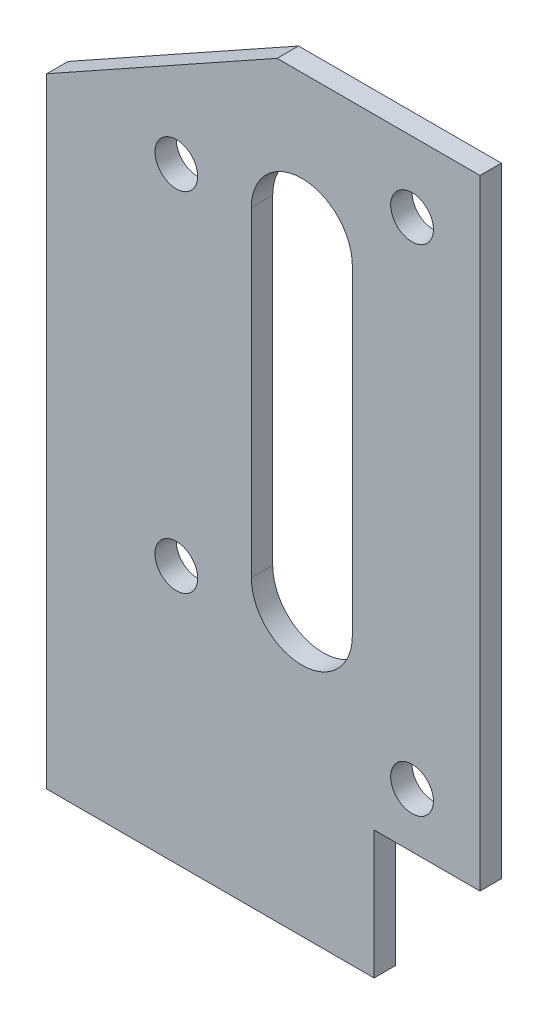
ISO-10303-21;
HEADER;
FILE_DESCRIPTION(('STEP AP214'),'2;1');
FILE_NAME('part.step','',(''),(''),'','','');
FILE_SCHEMA(('AUTOMOTIVE_DESIGN { 1 0 10303 214 1 1 1 1 }'));
ENDSEC;
DATA;
#1=APPLICATION_CONTEXT('core data for automotive mechanical design processes');
#2=APPLICATION_PROTOCOL_DEFINITION('international standard','automotive_design',2000,#1);
#3=PRODUCT_CONTEXT('',#1,'mechanical');
#4=PRODUCT('Part','Part','',(#3));
#5=PRODUCT_RELATED_PRODUCT_CATEGORY('part','',(#4));
#6=PRODUCT_DEFINITION_FORMATION('','',#4);
#7=PRODUCT_DEFINITION_CONTEXT('part definition',#1,'design');
#8=PRODUCT_DEFINITION('design','',#6,#7);
#9=PRODUCT_DEFINITION_SHAPE('','',#8);
#10=(LENGTH_UNIT() NAMED_UNIT(*) SI_UNIT(.MILLI.,.METRE.));
#11=(NAMED_UNIT(*) PLANE_ANGLE_UNIT() SI_UNIT($,.RADIAN.));
#12=(NAMED_UNIT(*) SI_UNIT($,.STERADIAN.) SOLID_ANGLE_UNIT());
#13=UNCERTAINTY_MEASURE_WITH_UNIT(LENGTH_MEASURE(1.E-05),#10,'distance_accuracy_value','');
#14=(GEOMETRIC_REPRESENTATION_CONTEXT(3) GLOBAL_UNCERTAINTY_ASSIGNED_CONTEXT((#13)) GLOBAL_UNIT_ASSIGNED_CONTEXT((#10,
#11,#12)) REPRESENTATION_CONTEXT('',''));
#15=CARTESIAN_POINT('',(0.,0.,0.));
#16=DIRECTION('',(0.,0.,1.));
#17=DIRECTION('',(1.,0.,0.));
#18=AXIS2_PLACEMENT_3D('',#15,#16,#17);
#19=CARTESIAN_POINT('',(0.,0.,10.));
#20=DIRECTION('',(0.,0.,1.));
#21=DIRECTION('',(1.,0.,0.));
#22=AXIS2_PLACEMENT_3D('',#19,#20,#21);
#23=PLANE('',#22);
#24=CARTESIAN_POINT('',(340.159565258512,67.6675286841399,10.));
#25=DIRECTION('',(0.,0.,1.));
#26=DIRECTION('',(1.,0.,0.));
#27=AXIS2_PLACEMENT_3D('',#24,#25,#26);
#28=CIRCLE('',#27,10.);
#29=CARTESIAN_POINT('',(350.159565258512,67.6675286841399,10.));
#30=VERTEX_POINT('',#29);
#31=EDGE_CURVE('E334',#30,#30,#28,.T.);
#32=ORIENTED_EDGE('',*,*,#31,.F.);
#33=EDGE_LOOP('',(#32));
#34=FACE_BOUND('',#33,.T.);
#35=CARTESIAN_POINT('',(229.870255563172,102.825256228943,10.));
#36=DIRECTION('',(0.,0.,1.));
#37=DIRECTION('',(1.,0.,0.));
#38=AXIS2_PLACEMENT_3D('',#35,#36,#37);
#39=CIRCLE('',#38,10.);
#40=CARTESIAN_POINT('',(239.870255563172,102.825256228943,10.));
#41=VERTEX_POINT('',#40);
#42=EDGE_CURVE('E158',#41,#41,#39,.T.);
#43=ORIENTED_EDGE('',*,*,#42,.F.);
#44=EDGE_LOOP('',(#43));
#45=FACE_BOUND('',#44,.T.);
#46=DIRECTION('',(-1.,0.,0.));
#47=VECTOR('',#46,1.);
#48=CARTESIAN_POINT('',(277.025034274635,332.140681003584,10.));
#49=LINE('',#48,#47);
#50=CARTESIAN_POINT('',(371.944880090182,332.140681003584,10.));
#51=VERTEX_POINT('',#50);
#52=CARTESIAN_POINT('',(277.025034274635,332.140681003584,10.));
#53=VERTEX_POINT('',#52);
#54=EDGE_CURVE('E174',#51,#53,#49,.T.);
#55=ORIENTED_EDGE('',*,*,#54,.T.);
#56=DIRECTION('',(-0.873276995123402,-0.48722406528028,0.));
#57=VECTOR('',#56,1.);
#58=CARTESIAN_POINT('',(277.025034274635,332.140681003584,10.));
#59=LINE('',#58,#57);
#60=CARTESIAN_POINT('',(169.18705459543,271.975052979122,10.));
#61=VERTEX_POINT('',#60);
#62=EDGE_CURVE('E178',#53,#61,#59,.T.);
#63=ORIENTED_EDGE('',*,*,#62,.T.);
#64=DIRECTION('',(0.,-1.,0.));
#65=VECTOR('',#64,1.);
#66=CARTESIAN_POINT('',(169.18705459543,271.975052979122,10.));
#67=LINE('',#66,#65);
#68=CARTESIAN_POINT('',(169.18705459543,-17.8593189964158,10.));
#69=VERTEX_POINT('',#68);
#70=EDGE_CURVE('E182',#61,#69,#67,.T.);
#71=ORIENTED_EDGE('',*,*,#70,.T.);
#72=DIRECTION('',(1.,0.,0.));
#73=VECTOR('',#72,1.);
#74=CARTESIAN_POINT('',(169.18705459543,-17.8593189964158,10.));
#75=LINE('',#74,#73);
#76=CARTESIAN_POINT('',(322.382476836474,-17.8593189964158,10.));
#77=VERTEX_POINT('',#76);
#78=EDGE_CURVE('E185',#69,#77,#75,.T.);
#79=ORIENTED_EDGE('',*,*,#78,.T.);
#80=DIRECTION('',(0.,1.,0.));
#81=VECTOR('',#80,1.);
#82=CARTESIAN_POINT('',(322.382476836474,-17.8593189964158,10.));
#83=LINE('',#82,#81);
#84=CARTESIAN_POINT('',(322.382476836474,42.1406810035843,10.));
#85=VERTEX_POINT('',#84);
#86=EDGE_CURVE('E188',#77,#85,#83,.T.);
#87=ORIENTED_EDGE('',*,*,#86,.T.);
#88=DIRECTION('',(1.,0.,0.));
#89=VECTOR('',#88,1.);
#90=CARTESIAN_POINT('',(322.382476836474,42.1406810035843,10.));
#91=LINE('',#90,#89);
#92=CARTESIAN_POINT('',(371.944880090182,42.1406810035843,10.));
#93=VERTEX_POINT('',#92);
#94=EDGE_CURVE('E191',#85,#93,#91,.T.);
#95=ORIENTED_EDGE('',*,*,#94,.T.);
#96=DIRECTION('',(0.,1.,0.));
#97=VECTOR('',#96,1.);
#98=CARTESIAN_POINT('',(371.944880090182,42.1406810035843,10.));
#99=LINE('',#98,#97);
#100=EDGE_CURVE('E194',#93,#51,#99,.T.);
#101=ORIENTED_EDGE('',*,*,#100,.T.);
#102=EDGE_LOOP('',(#55,#63,#71,#79,#87,#95,#101));
#103=FACE_BOUND('',#102,.T.);
#104=DIRECTION('',(0.,-1.,0.));
#105=VECTOR('',#104,1.);
#106=CARTESIAN_POINT('',(264.957256952062,265.671146953405,10.));
#107=LINE('',#106,#105);
#108=CARTESIAN_POINT('',(264.957256952062,265.671146953405,10.));
#109=VERTEX_POINT('',#108);
#110=CARTESIAN_POINT('',(264.957256952062,115.671146953405,10.));
#111=VERTEX_POINT('',#110);
#112=EDGE_CURVE('E132',#109,#111,#107,.T.);
#113=ORIENTED_EDGE('',*,*,#112,.F.);
#114=CARTESIAN_POINT('',(288.591642628585,265.671146953405,10.));
#115=DIRECTION('',(0.,0.,1.));
#116=DIRECTION('',(1.,0.,0.));
#117=AXIS2_PLACEMENT_3D('',#114,#115,#116);
#118=CIRCLE('',#117,23.6343856765227);
#119=CARTESIAN_POINT('',(312.226028305107,265.671146953405,10.));
#120=VERTEX_POINT('',#119);
#121=EDGE_CURVE('E123',#120,#109,#118,.T.);
#122=ORIENTED_EDGE('',*,*,#121,.F.);
#123=DIRECTION('',(0.,1.,0.));
#124=VECTOR('',#123,1.);
#125=CARTESIAN_POINT('',(312.226028305107,265.671146953405,10.));
#126=LINE('',#125,#124);
#127=CARTESIAN_POINT('',(312.226028305107,115.671146953405,10.));
#128=VERTEX_POINT('',#127);
#129=EDGE_CURVE('E150',#128,#120,#126,.T.);
#130=ORIENTED_EDGE('',*,*,#129,.F.);
#131=CARTESIAN_POINT('',(288.591642628585,115.671146953405,10.));
#132=DIRECTION('',(0.,0.,1.));
#133=DIRECTION('',(1.,0.,0.));
#134=AXIS2_PLACEMENT_3D('',#131,#132,#133);
#135=CIRCLE('',#134,23.6343856765226);
#136=EDGE_CURVE('E146',#111,#128,#135,.T.);
#137=ORIENTED_EDGE('',*,*,#136,.F.);
#138=EDGE_LOOP('',(#113,#122,#130,#137));
#139=FACE_BOUND('',#138,.T.);
#140=CARTESIAN_POINT('',(340.159565258512,299.323240314964,10.));
#141=DIRECTION('',(0.,0.,1.));
#142=DIRECTION('',(1.,0.,0.));
#143=AXIS2_PLACEMENT_3D('',#140,#141,#142);
#144=CIRCLE('',#143,10.);
#145=CARTESIAN_POINT('',(350.159565258512,299.323240314964,10.));
#146=VERTEX_POINT('',#145);
#147=EDGE_CURVE('E342',#146,#146,#144,.T.);
#148=ORIENTED_EDGE('',*,*,#147,.F.);
#149=EDGE_LOOP('',(#148));
#150=FACE_BOUND('',#149,.T.);
#151=CARTESIAN_POINT('',(229.870255563172,265.671146953405,10.));
#152=DIRECTION('',(0.,0.,1.));
#153=DIRECTION('',(1.,0.,0.));
#154=AXIS2_PLACEMENT_3D('',#151,#152,#153);
#155=CIRCLE('',#154,10.);
#156=CARTESIAN_POINT('',(239.870255563172,265.671146953405,10.));
#157=VERTEX_POINT('',#156);
#158=EDGE_CURVE('E323',#157,#157,#155,.T.);
#159=ORIENTED_EDGE('',*,*,#158,.F.);
#160=EDGE_LOOP('',(#159));
#161=FACE_BOUND('',#160,.T.);
#162=ADVANCED_FACE('F39',(#34,#45,#103,#139,#150,#161),#23,.T.);
#163=CARTESIAN_POINT('',(0.,0.,0.));
#164=DIRECTION('',(0.,0.,1.));
#165=DIRECTION('',(1.,0.,0.));
#166=AXIS2_PLACEMENT_3D('',#163,#164,#165);
#167=PLANE('',#166);
#168=DIRECTION('',(-1.,0.,0.));
#169=VECTOR('',#168,1.);
#170=CARTESIAN_POINT('',(277.025034274635,332.140681003584,0.));
#171=LINE('',#170,#169);
#172=CARTESIAN_POINT('',(371.944880090182,332.140681003584,0.));
#173=VERTEX_POINT('',#172);
#174=CARTESIAN_POINT('',(277.025034274635,332.140681003584,0.));
#175=VERTEX_POINT('',#174);
#176=EDGE_CURVE('E141',#173,#175,#171,.T.);
#177=ORIENTED_EDGE('',*,*,#176,.F.);
#178=DIRECTION('',(0.,1.,0.));
#179=VECTOR('',#178,1.);
#180=CARTESIAN_POINT('',(371.944880090182,42.1406810035843,0.));
#181=LINE('',#180,#179);
#182=CARTESIAN_POINT('',(371.944880090182,42.1406810035843,0.));
#183=VERTEX_POINT('',#182);
#184=EDGE_CURVE('E179',#183,#173,#181,.T.);
#185=ORIENTED_EDGE('',*,*,#184,.F.);
#186=DIRECTION('',(1.,0.,0.));
#187=VECTOR('',#186,1.);
#188=CARTESIAN_POINT('',(322.382476836474,42.1406810035843,0.));
#189=LINE('',#188,#187);
#190=CARTESIAN_POINT('',(322.382476836474,42.1406810035843,0.));
#191=VERTEX_POINT('',#190);
#192=EDGE_CURVE('E214',#191,#183,#189,.T.);
#193=ORIENTED_EDGE('',*,*,#192,.F.);
#194=DIRECTION('',(0.,1.,0.));
#195=VECTOR('',#194,1.);
#196=CARTESIAN_POINT('',(322.382476836474,-17.8593189964158,0.));
#197=LINE('',#196,#195);
#198=CARTESIAN_POINT('',(322.382476836474,-17.8593189964158,0.));
#199=VERTEX_POINT('',#198);
#200=EDGE_CURVE('E211',#199,#191,#197,.T.);
#201=ORIENTED_EDGE('',*,*,#200,.F.);
#202=DIRECTION('',(1.,0.,0.));
#203=VECTOR('',#202,1.);
#204=CARTESIAN_POINT('',(169.18705459543,-17.8593189964158,0.));
#205=LINE('',#204,#203);
#206=CARTESIAN_POINT('',(169.18705459543,-17.8593189964158,0.));
#207=VERTEX_POINT('',#206);
#208=EDGE_CURVE('E208',#207,#199,#205,.T.);
#209=ORIENTED_EDGE('',*,*,#208,.F.);
#210=DIRECTION('',(0.,-1.,0.));
#211=VECTOR('',#210,1.);
#212=CARTESIAN_POINT('',(169.18705459543,205.170044113593,0.));
#213=LINE('',#212,#211);
#214=CARTESIAN_POINT('',(169.18705459543,271.975052979122,0.));
#215=VERTEX_POINT('',#214);
#216=EDGE_CURVE('E205',#215,#207,#213,.T.);
#217=ORIENTED_EDGE('',*,*,#216,.F.);
#218=DIRECTION('',(-0.873276995123402,-0.48722406528028,0.));
#219=VECTOR('',#218,1.);
#220=CARTESIAN_POINT('',(277.025034274635,332.140681003584,0.));
#221=LINE('',#220,#219);
#222=EDGE_CURVE('E201',#175,#215,#221,.T.);
#223=ORIENTED_EDGE('',*,*,#222,.F.);
#224=EDGE_LOOP('',(#177,#185,#193,#201,#209,#217,#223));
#225=FACE_BOUND('',#224,.T.);
#226=CARTESIAN_POINT('',(288.591642628585,265.671146953405,0.));
#227=DIRECTION('',(0.,0.,1.));
#228=DIRECTION('',(1.,0.,0.));
#229=AXIS2_PLACEMENT_3D('',#226,#227,#228);
#230=CIRCLE('',#229,23.6343856765227);
#231=CARTESIAN_POINT('',(312.226028305107,265.671146953405,0.));
#232=VERTEX_POINT('',#231);
#233=CARTESIAN_POINT('',(264.957256952062,265.671146953405,0.));
#234=VERTEX_POINT('',#233);
#235=EDGE_CURVE('E63',#232,#234,#230,.T.);
#236=ORIENTED_EDGE('',*,*,#235,.T.);
#237=DIRECTION('',(0.,-1.,0.));
#238=VECTOR('',#237,1.);
#239=CARTESIAN_POINT('',(264.957256952062,265.671146953405,0.));
#240=LINE('',#239,#238);
#241=CARTESIAN_POINT('',(264.957256952062,115.671146953405,0.));
#242=VERTEX_POINT('',#241);
#243=EDGE_CURVE('E139',#234,#242,#240,.T.);
#244=ORIENTED_EDGE('',*,*,#243,.T.);
#245=CARTESIAN_POINT('',(288.591642628585,115.671146953405,0.));
#246=DIRECTION('',(0.,0.,1.));
#247=DIRECTION('',(1.,0.,0.));
#248=AXIS2_PLACEMENT_3D('',#245,#246,#247);
#249=CIRCLE('',#248,23.6343856765226);
#250=CARTESIAN_POINT('',(312.226028305107,115.671146953405,0.));
#251=VERTEX_POINT('',#250);
#252=EDGE_CURVE('E161',#242,#251,#249,.T.);
#253=ORIENTED_EDGE('',*,*,#252,.T.);
#254=DIRECTION('',(0.,1.,0.));
#255=VECTOR('',#254,1.);
#256=CARTESIAN_POINT('',(312.226028305107,265.671146953405,0.));
#257=LINE('',#256,#255);
#258=EDGE_CURVE('E133',#251,#232,#257,.T.);
#259=ORIENTED_EDGE('',*,*,#258,.T.);
#260=EDGE_LOOP('',(#236,#244,#253,#259));
#261=FACE_BOUND('',#260,.T.);
#262=CARTESIAN_POINT('',(229.870255563172,102.825256228943,0.));
#263=DIRECTION('',(0.,0.,1.));
#264=DIRECTION('',(1.,0.,0.));
#265=AXIS2_PLACEMENT_3D('',#262,#263,#264);
#266=CIRCLE('',#265,10.);
#267=CARTESIAN_POINT('',(239.870255563172,102.825256228943,0.));
#268=VERTEX_POINT('',#267);
#269=EDGE_CURVE('E346',#268,#268,#266,.T.);
#270=ORIENTED_EDGE('',*,*,#269,.T.);
#271=EDGE_LOOP('',(#270));
#272=FACE_BOUND('',#271,.T.);
#273=CARTESIAN_POINT('',(340.159565258512,299.323240314964,0.));
#274=DIRECTION('',(0.,0.,1.));
#275=DIRECTION('',(1.,0.,0.));
#276=AXIS2_PLACEMENT_3D('',#273,#274,#275);
#277=CIRCLE('',#276,10.);
#278=CARTESIAN_POINT('',(350.159565258512,299.323240314964,0.));
#279=VERTEX_POINT('',#278);
#280=EDGE_CURVE('E338',#279,#279,#277,.T.);
#281=ORIENTED_EDGE('',*,*,#280,.T.);
#282=EDGE_LOOP('',(#281));
#283=FACE_BOUND('',#282,.T.);
#284=CARTESIAN_POINT('',(340.159565258512,67.6675286841399,0.));
#285=DIRECTION('',(0.,0.,1.));
#286=DIRECTION('',(1.,0.,0.));
#287=AXIS2_PLACEMENT_3D('',#284,#285,#286);
#288=CIRCLE('',#287,10.);
#289=CARTESIAN_POINT('',(350.159565258512,67.6675286841399,0.));
#290=VERTEX_POINT('',#289);
#291=EDGE_CURVE('E331',#290,#290,#288,.T.);
#292=ORIENTED_EDGE('',*,*,#291,.T.);
#293=EDGE_LOOP('',(#292));
#294=FACE_BOUND('',#293,.T.);
#295=CARTESIAN_POINT('',(229.870255563172,265.671146953405,0.));
#296=DIRECTION('',(0.,0.,1.));
#297=DIRECTION('',(1.,0.,0.));
#298=AXIS2_PLACEMENT_3D('',#295,#296,#297);
#299=CIRCLE('',#298,10.);
#300=CARTESIAN_POINT('',(239.870255563172,265.671146953405,0.));
#301=VERTEX_POINT('',#300);
#302=EDGE_CURVE('E326',#301,#301,#299,.T.);
#303=ORIENTED_EDGE('',*,*,#302,.T.);
#304=EDGE_LOOP('',(#303));
#305=FACE_BOUND('',#304,.T.);
#306=ADVANCED_FACE('F249',(#225,#261,#272,#283,#294,#305),#167,.F.);
#307=CARTESIAN_POINT('',(277.025034274635,332.140681003584,10.));
#308=DIRECTION('',(0.,-1.,0.));
#309=DIRECTION('',(0.,0.,-1.));
#310=AXIS2_PLACEMENT_3D('',#307,#308,#309);
#311=PLANE('',#310);
#312=ORIENTED_EDGE('',*,*,#176,.T.);
#313=DIRECTION('',(0.,0.,-1.));
#314=VECTOR('',#313,1.);
#315=CARTESIAN_POINT('',(277.025034274635,332.140681003584,10.));
#316=LINE('',#315,#314);
#317=EDGE_CURVE('E11',#53,#175,#316,.T.);
#318=ORIENTED_EDGE('',*,*,#317,.F.);
#319=ORIENTED_EDGE('',*,*,#54,.F.);
#320=DIRECTION('',(0.,0.,-1.));
#321=VECTOR('',#320,1.);
#322=CARTESIAN_POINT('',(371.944880090182,332.140681003584,10.));
#323=LINE('',#322,#321);
#324=EDGE_CURVE('E197',#51,#173,#323,.T.);
#325=ORIENTED_EDGE('',*,*,#324,.T.);
#326=EDGE_LOOP('',(#312,#318,#319,#325));
#327=FACE_BOUND('',#326,.T.);
#328=ADVANCED_FACE('F41',(#327),#311,.F.);
#329=CARTESIAN_POINT('',(277.025034274635,332.140681003584,10.));
#330=DIRECTION('',(0.48722406528028,-0.873276995123402,0.));
#331=DIRECTION('',(0.873276995123402,0.48722406528028,0.));
#332=AXIS2_PLACEMENT_3D('',#329,#330,#331);
#333=PLANE('',#332);
#334=ORIENTED_EDGE('',*,*,#222,.T.);
#335=DIRECTION('',(0.,0.,-1.));
#336=VECTOR('',#335,1.);
#337=CARTESIAN_POINT('',(169.18705459543,271.975052979122,10.));
#338=LINE('',#337,#336);
#339=EDGE_CURVE('E48',#61,#215,#338,.T.);
#340=ORIENTED_EDGE('',*,*,#339,.F.);
#341=ORIENTED_EDGE('',*,*,#62,.F.);
#342=ORIENTED_EDGE('',*,*,#317,.T.);
#343=EDGE_LOOP('',(#334,#340,#341,#342));
#344=FACE_BOUND('',#343,.T.);
#345=ADVANCED_FACE('F245',(#344),#333,.F.);
#346=CARTESIAN_POINT('',(169.18705459543,205.170044113593,10.));
#347=DIRECTION('',(1.,0.,0.));
#348=DIRECTION('',(0.,0.,-1.));
#349=AXIS2_PLACEMENT_3D('',#346,#347,#348);
#350=PLANE('',#349);
#351=ORIENTED_EDGE('',*,*,#216,.T.);
#352=DIRECTION('',(0.,0.,-1.));
#353=VECTOR('',#352,1.);
#354=CARTESIAN_POINT('',(169.18705459543,-17.8593189964158,10.));
#355=LINE('',#354,#353);
#356=EDGE_CURVE('E234',#69,#207,#355,.T.);
#357=ORIENTED_EDGE('',*,*,#356,.F.);
#358=ORIENTED_EDGE('',*,*,#70,.F.);
#359=ORIENTED_EDGE('',*,*,#339,.T.);
#360=EDGE_LOOP('',(#351,#357,#358,#359));
#361=FACE_BOUND('',#360,.T.);
#362=ADVANCED_FACE('F242',(#361),#350,.F.);
#363=CARTESIAN_POINT('',(169.18705459543,-17.8593189964158,10.));
#364=DIRECTION('',(0.,1.,0.));
#365=DIRECTION('',(0.,0.,1.));
#366=AXIS2_PLACEMENT_3D('',#363,#364,#365);
#367=PLANE('',#366);
#368=ORIENTED_EDGE('',*,*,#208,.T.);
#369=DIRECTION('',(0.,0.,-1.));
#370=VECTOR('',#369,1.);
#371=CARTESIAN_POINT('',(322.382476836474,-17.8593189964158,10.));
#372=LINE('',#371,#370);
#373=EDGE_CURVE('E230',#77,#199,#372,.T.);
#374=ORIENTED_EDGE('',*,*,#373,.F.);
#375=ORIENTED_EDGE('',*,*,#78,.F.);
#376=ORIENTED_EDGE('',*,*,#356,.T.);
#377=EDGE_LOOP('',(#368,#374,#375,#376));
#378=FACE_BOUND('',#377,.T.);
#379=ADVANCED_FACE('F257',(#378),#367,.F.);
#380=CARTESIAN_POINT('',(322.382476836474,-17.8593189964158,10.));
#381=DIRECTION('',(-1.,0.,0.));
#382=DIRECTION('',(0.,0.,1.));
#383=AXIS2_PLACEMENT_3D('',#380,#381,#382);
#384=PLANE('',#383);
#385=ORIENTED_EDGE('',*,*,#200,.T.);
#386=DIRECTION('',(0.,0.,-1.));
#387=VECTOR('',#386,1.);
#388=CARTESIAN_POINT('',(322.382476836474,42.1406810035843,10.));
#389=LINE('',#388,#387);
#390=EDGE_CURVE('E226',#85,#191,#389,.T.);
#391=ORIENTED_EDGE('',*,*,#390,.F.);
#392=ORIENTED_EDGE('',*,*,#86,.F.);
#393=ORIENTED_EDGE('',*,*,#373,.T.);
#394=EDGE_LOOP('',(#385,#391,#392,#393));
#395=FACE_BOUND('',#394,.T.);
#396=ADVANCED_FACE('F261',(#395),#384,.F.);
#397=CARTESIAN_POINT('',(322.382476836474,42.1406810035843,10.));
#398=DIRECTION('',(0.,1.,0.));
#399=DIRECTION('',(0.,0.,1.));
#400=AXIS2_PLACEMENT_3D('',#397,#398,#399);
#401=PLANE('',#400);
#402=ORIENTED_EDGE('',*,*,#192,.T.);
#403=DIRECTION('',(0.,0.,-1.));
#404=VECTOR('',#403,1.);
#405=CARTESIAN_POINT('',(371.944880090182,42.1406810035843,10.));
#406=LINE('',#405,#404);
#407=EDGE_CURVE('E222',#93,#183,#406,.T.);
#408=ORIENTED_EDGE('',*,*,#407,.F.);
#409=ORIENTED_EDGE('',*,*,#94,.F.);
#410=ORIENTED_EDGE('',*,*,#390,.T.);
#411=EDGE_LOOP('',(#402,#408,#409,#410));
#412=FACE_BOUND('',#411,.T.);
#413=ADVANCED_FACE('F273',(#412),#401,.F.);
#414=CARTESIAN_POINT('',(371.944880090182,42.1406810035843,10.));
#415=DIRECTION('',(-1.,0.,0.));
#416=DIRECTION('',(0.,0.,1.));
#417=AXIS2_PLACEMENT_3D('',#414,#415,#416);
#418=PLANE('',#417);
#419=ORIENTED_EDGE('',*,*,#184,.T.);
#420=ORIENTED_EDGE('',*,*,#324,.F.);
#421=ORIENTED_EDGE('',*,*,#100,.F.);
#422=ORIENTED_EDGE('',*,*,#407,.T.);
#423=EDGE_LOOP('',(#419,#420,#421,#422));
#424=FACE_BOUND('',#423,.T.);
#425=ADVANCED_FACE('F271',(#424),#418,.F.);
#426=CARTESIAN_POINT('',(288.591642628585,265.671146953405,10.));
#427=DIRECTION('',(0.,0.,-1.));
#428=DIRECTION('',(-1.,0.,0.));
#429=AXIS2_PLACEMENT_3D('',#426,#427,#428);
#430=CYLINDRICAL_SURFACE('',#429,23.6343856765227);
#431=ORIENTED_EDGE('',*,*,#235,.F.);
#432=DIRECTION('',(0.,0.,-1.));
#433=VECTOR('',#432,1.);
#434=CARTESIAN_POINT('',(312.226028305107,265.671146953405,10.));
#435=LINE('',#434,#433);
#436=EDGE_CURVE('E127',#120,#232,#435,.T.);
#437=ORIENTED_EDGE('',*,*,#436,.F.);
#438=ORIENTED_EDGE('',*,*,#121,.T.);
#439=DIRECTION('',(0.,0.,-1.));
#440=VECTOR('',#439,1.);
#441=CARTESIAN_POINT('',(264.957256952062,265.671146953405,10.));
#442=LINE('',#441,#440);
#443=EDGE_CURVE('E126',#109,#234,#442,.T.);
#444=ORIENTED_EDGE('',*,*,#443,.T.);
#445=EDGE_LOOP('',(#431,#437,#438,#444));
#446=FACE_BOUND('',#445,.T.);
#447=ADVANCED_FACE('F125',(#446),#430,.F.);
#448=CARTESIAN_POINT('',(264.957256952062,265.671146953405,10.));
#449=DIRECTION('',(1.,0.,0.));
#450=DIRECTION('',(0.,1.,0.));
#451=AXIS2_PLACEMENT_3D('',#448,#449,#450);
#452=PLANE('',#451);
#453=ORIENTED_EDGE('',*,*,#243,.F.);
#454=ORIENTED_EDGE('',*,*,#443,.F.);
#455=ORIENTED_EDGE('',*,*,#112,.T.);
#456=DIRECTION('',(0.,0.,-1.));
#457=VECTOR('',#456,1.);
#458=CARTESIAN_POINT('',(264.957256952062,115.671146953405,10.));
#459=LINE('',#458,#457);
#460=EDGE_CURVE('E142',#111,#242,#459,.T.);
#461=ORIENTED_EDGE('',*,*,#460,.T.);
#462=EDGE_LOOP('',(#453,#454,#455,#461));
#463=FACE_BOUND('',#462,.T.);
#464=ADVANCED_FACE('F136',(#463),#452,.T.);
#465=CARTESIAN_POINT('',(288.591642628585,115.671146953405,10.));
#466=DIRECTION('',(0.,0.,-1.));
#467=DIRECTION('',(-1.,0.,0.));
#468=AXIS2_PLACEMENT_3D('',#465,#466,#467);
#469=CYLINDRICAL_SURFACE('',#468,23.6343856765226);
#470=ORIENTED_EDGE('',*,*,#252,.F.);
#471=ORIENTED_EDGE('',*,*,#460,.F.);
#472=ORIENTED_EDGE('',*,*,#136,.T.);
#473=DIRECTION('',(0.,0.,-1.));
#474=VECTOR('',#473,1.);
#475=CARTESIAN_POINT('',(312.226028305107,115.671146953405,10.));
#476=LINE('',#475,#474);
#477=EDGE_CURVE('E55',#128,#251,#476,.T.);
#478=ORIENTED_EDGE('',*,*,#477,.T.);
#479=EDGE_LOOP('',(#470,#471,#472,#478));
#480=FACE_BOUND('',#479,.T.);
#481=ADVANCED_FACE('F296',(#480),#469,.F.);
#482=CARTESIAN_POINT('',(312.226028305107,265.671146953405,10.));
#483=DIRECTION('',(-1.,0.,0.));
#484=DIRECTION('',(0.,0.,1.));
#485=AXIS2_PLACEMENT_3D('',#482,#483,#484);
#486=PLANE('',#485);
#487=ORIENTED_EDGE('',*,*,#258,.F.);
#488=ORIENTED_EDGE('',*,*,#477,.F.);
#489=ORIENTED_EDGE('',*,*,#129,.T.);
#490=ORIENTED_EDGE('',*,*,#436,.T.);
#491=EDGE_LOOP('',(#487,#488,#489,#490));
#492=FACE_BOUND('',#491,.T.);
#493=ADVANCED_FACE('F299',(#492),#486,.T.);
#494=CARTESIAN_POINT('',(229.870255563172,102.825256228943,10.));
#495=DIRECTION('',(0.,0.,-1.));
#496=DIRECTION('',(-1.,0.,0.));
#497=AXIS2_PLACEMENT_3D('',#494,#495,#496);
#498=CYLINDRICAL_SURFACE('',#497,10.);
#499=ORIENTED_EDGE('',*,*,#42,.T.);
#500=EDGE_LOOP('',(#499));
#501=FACE_BOUND('',#500,.T.);
#502=ORIENTED_EDGE('',*,*,#269,.F.);
#503=EDGE_LOOP('',(#502));
#504=FACE_BOUND('',#503,.T.);
#505=ADVANCED_FACE('F303',(#501,#504),#498,.F.);
#506=CARTESIAN_POINT('',(340.159565258512,299.323240314964,10.));
#507=DIRECTION('',(0.,0.,-1.));
#508=DIRECTION('',(-1.,0.,0.));
#509=AXIS2_PLACEMENT_3D('',#506,#507,#508);
#510=CYLINDRICAL_SURFACE('',#509,10.);
#511=ORIENTED_EDGE('',*,*,#147,.T.);
#512=EDGE_LOOP('',(#511));
#513=FACE_BOUND('',#512,.T.);
#514=ORIENTED_EDGE('',*,*,#280,.F.);
#515=EDGE_LOOP('',(#514));
#516=FACE_BOUND('',#515,.T.);
#517=ADVANCED_FACE('F306',(#513,#516),#510,.F.);
#518=CARTESIAN_POINT('',(340.159565258512,67.6675286841399,10.));
#519=DIRECTION('',(0.,0.,-1.));
#520=DIRECTION('',(-1.,0.,0.));
#521=AXIS2_PLACEMENT_3D('',#518,#519,#520);
#522=CYLINDRICAL_SURFACE('',#521,10.);
#523=ORIENTED_EDGE('',*,*,#31,.T.);
#524=EDGE_LOOP('',(#523));
#525=FACE_BOUND('',#524,.T.);
#526=ORIENTED_EDGE('',*,*,#291,.F.);
#527=EDGE_LOOP('',(#526));
#528=FACE_BOUND('',#527,.T.);
#529=ADVANCED_FACE('F310',(#525,#528),#522,.F.);
#530=CARTESIAN_POINT('',(229.870255563172,265.671146953405,10.));
#531=DIRECTION('',(0.,0.,-1.));
#532=DIRECTION('',(-1.,0.,0.));
#533=AXIS2_PLACEMENT_3D('',#530,#531,#532);
#534=CYLINDRICAL_SURFACE('',#533,10.);
#535=ORIENTED_EDGE('',*,*,#158,.T.);
#536=EDGE_LOOP('',(#535));
#537=FACE_BOUND('',#536,.T.);
#538=ORIENTED_EDGE('',*,*,#302,.F.);
#539=EDGE_LOOP('',(#538));
#540=FACE_BOUND('',#539,.T.);
#541=ADVANCED_FACE('F314',(#537,#540),#534,.F.);
#542=CLOSED_SHELL('',(#162,#306,#328,#345,#362,#379,#396,#413,#425,#447,#464,#481,#493,#505,
#517,#529,#541));
#543=MANIFOLD_SOLID_BREP('B2',#542);
#544=ADVANCED_BREP_SHAPE_REPRESENTATION('',(#18,#543),#14);
#545=SHAPE_DEFINITION_REPRESENTATION(#9,#544);
ENDSEC;
END-ISO-10303-21;
